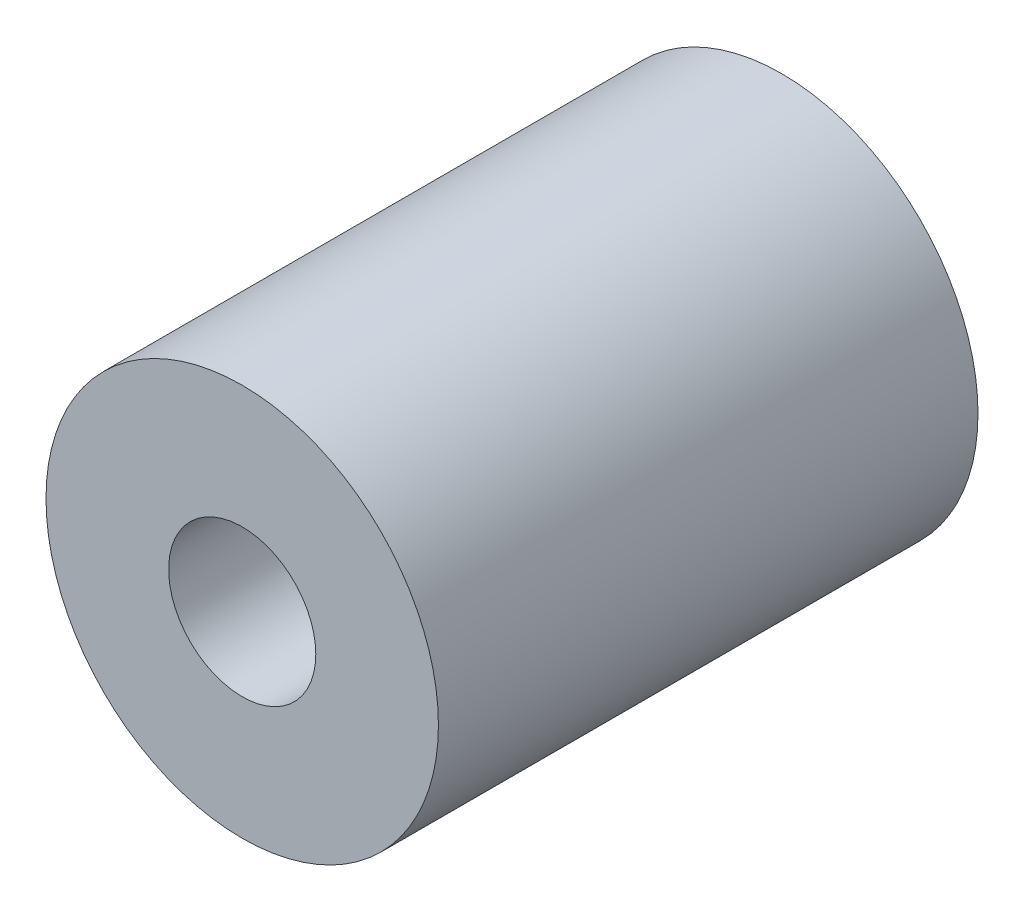
ISO-10303-21;
HEADER;
FILE_DESCRIPTION(('STEP AP214'),'2;1');
FILE_NAME('part.step','',(''),(''),'','','');
FILE_SCHEMA(('AUTOMOTIVE_DESIGN { 1 0 10303 214 1 1 1 1 }'));
ENDSEC;
DATA;
#1=APPLICATION_CONTEXT('core data for automotive mechanical design processes');
#2=APPLICATION_PROTOCOL_DEFINITION('international standard','automotive_design',2000,#1);
#3=PRODUCT_CONTEXT('',#1,'mechanical');
#4=PRODUCT('Part','Part','',(#3));
#5=PRODUCT_RELATED_PRODUCT_CATEGORY('part','',(#4));
#6=PRODUCT_DEFINITION_FORMATION('','',#4);
#7=PRODUCT_DEFINITION_CONTEXT('part definition',#1,'design');
#8=PRODUCT_DEFINITION('design','',#6,#7);
#9=PRODUCT_DEFINITION_SHAPE('','',#8);
#10=(LENGTH_UNIT() NAMED_UNIT(*) SI_UNIT(.MILLI.,.METRE.));
#11=(NAMED_UNIT(*) PLANE_ANGLE_UNIT() SI_UNIT($,.RADIAN.));
#12=(NAMED_UNIT(*) SI_UNIT($,.STERADIAN.) SOLID_ANGLE_UNIT());
#13=UNCERTAINTY_MEASURE_WITH_UNIT(LENGTH_MEASURE(1.E-05),#10,'distance_accuracy_value','');
#14=(GEOMETRIC_REPRESENTATION_CONTEXT(3) GLOBAL_UNCERTAINTY_ASSIGNED_CONTEXT((#13)) GLOBAL_UNIT_ASSIGNED_CONTEXT((#10,
#11,#12)) REPRESENTATION_CONTEXT('',''));
#15=CARTESIAN_POINT('',(0.,0.,0.));
#16=DIRECTION('',(0.,0.,1.));
#17=DIRECTION('',(1.,0.,0.));
#18=AXIS2_PLACEMENT_3D('',#15,#16,#17);
#19=CARTESIAN_POINT('',(0.,0.,11.));
#20=DIRECTION('',(0.,0.,1.));
#21=DIRECTION('',(1.,0.,0.));
#22=AXIS2_PLACEMENT_3D('',#19,#20,#21);
#23=PLANE('',#22);
#24=CARTESIAN_POINT('',(0.,0.,11.));
#25=DIRECTION('',(0.,0.,1.));
#26=DIRECTION('',(1.,0.,0.));
#27=AXIS2_PLACEMENT_3D('',#24,#25,#26);
#28=CIRCLE('',#27,8.);
#29=CARTESIAN_POINT('',(8.,0.,11.));
#30=VERTEX_POINT('',#29);
#31=EDGE_CURVE('E10',#30,#30,#28,.T.);
#32=ORIENTED_EDGE('',*,*,#31,.T.);
#33=EDGE_LOOP('',(#32));
#34=FACE_BOUND('',#33,.T.);
#35=CARTESIAN_POINT('',(0.,0.,11.));
#36=DIRECTION('',(0.,0.,1.));
#37=DIRECTION('',(1.,0.,0.));
#38=AXIS2_PLACEMENT_3D('',#35,#36,#37);
#39=CIRCLE('',#38,3.);
#40=CARTESIAN_POINT('',(3.,0.,11.));
#41=VERTEX_POINT('',#40);
#42=EDGE_CURVE('E44',#41,#41,#39,.T.);
#43=ORIENTED_EDGE('',*,*,#42,.F.);
#44=EDGE_LOOP('',(#43));
#45=FACE_BOUND('',#44,.T.);
#46=ADVANCED_FACE('F33',(#34,#45),#23,.T.);
#47=CARTESIAN_POINT('',(0.,0.,-11.));
#48=DIRECTION('',(0.,0.,1.));
#49=DIRECTION('',(1.,0.,0.));
#50=AXIS2_PLACEMENT_3D('',#47,#48,#49);
#51=PLANE('',#50);
#52=CARTESIAN_POINT('',(0.,0.,-11.));
#53=DIRECTION('',(0.,0.,1.));
#54=DIRECTION('',(1.,0.,0.));
#55=AXIS2_PLACEMENT_3D('',#52,#53,#54);
#56=CIRCLE('',#55,8.);
#57=CARTESIAN_POINT('',(8.,0.,-11.));
#58=VERTEX_POINT('',#57);
#59=EDGE_CURVE('E37',#58,#58,#56,.T.);
#60=ORIENTED_EDGE('',*,*,#59,.F.);
#61=EDGE_LOOP('',(#60));
#62=FACE_BOUND('',#61,.T.);
#63=CARTESIAN_POINT('',(0.,0.,-11.));
#64=DIRECTION('',(0.,0.,1.));
#65=DIRECTION('',(1.,0.,0.));
#66=AXIS2_PLACEMENT_3D('',#63,#64,#65);
#67=CIRCLE('',#66,3.);
#68=CARTESIAN_POINT('',(3.,0.,-11.));
#69=VERTEX_POINT('',#68);
#70=EDGE_CURVE('E46',#69,#69,#67,.T.);
#71=ORIENTED_EDGE('',*,*,#70,.T.);
#72=EDGE_LOOP('',(#71));
#73=FACE_BOUND('',#72,.T.);
#74=ADVANCED_FACE('F56',(#62,#73),#51,.F.);
#75=CARTESIAN_POINT('',(0.,0.,11.));
#76=DIRECTION('',(0.,0.,-1.));
#77=DIRECTION('',(-1.,0.,0.));
#78=AXIS2_PLACEMENT_3D('',#75,#76,#77);
#79=CYLINDRICAL_SURFACE('',#78,8.);
#80=ORIENTED_EDGE('',*,*,#31,.F.);
#81=EDGE_LOOP('',(#80));
#82=FACE_BOUND('',#81,.T.);
#83=ORIENTED_EDGE('',*,*,#59,.T.);
#84=EDGE_LOOP('',(#83));
#85=FACE_BOUND('',#84,.T.);
#86=ADVANCED_FACE('F35',(#82,#85),#79,.T.);
#87=CARTESIAN_POINT('',(0.,0.,11.));
#88=DIRECTION('',(0.,0.,-1.));
#89=DIRECTION('',(-1.,0.,0.));
#90=AXIS2_PLACEMENT_3D('',#87,#88,#89);
#91=CYLINDRICAL_SURFACE('',#90,3.);
#92=ORIENTED_EDGE('',*,*,#42,.T.);
#93=EDGE_LOOP('',(#92));
#94=FACE_BOUND('',#93,.T.);
#95=ORIENTED_EDGE('',*,*,#70,.F.);
#96=EDGE_LOOP('',(#95));
#97=FACE_BOUND('',#96,.T.);
#98=ADVANCED_FACE('F52',(#94,#97),#91,.F.);
#99=CLOSED_SHELL('',(#46,#74,#86,#98));
#100=MANIFOLD_SOLID_BREP('B2',#99);
#101=ADVANCED_BREP_SHAPE_REPRESENTATION('',(#18,#100),#14);
#102=SHAPE_DEFINITION_REPRESENTATION(#9,#101);
ENDSEC;
END-ISO-10303-21;
